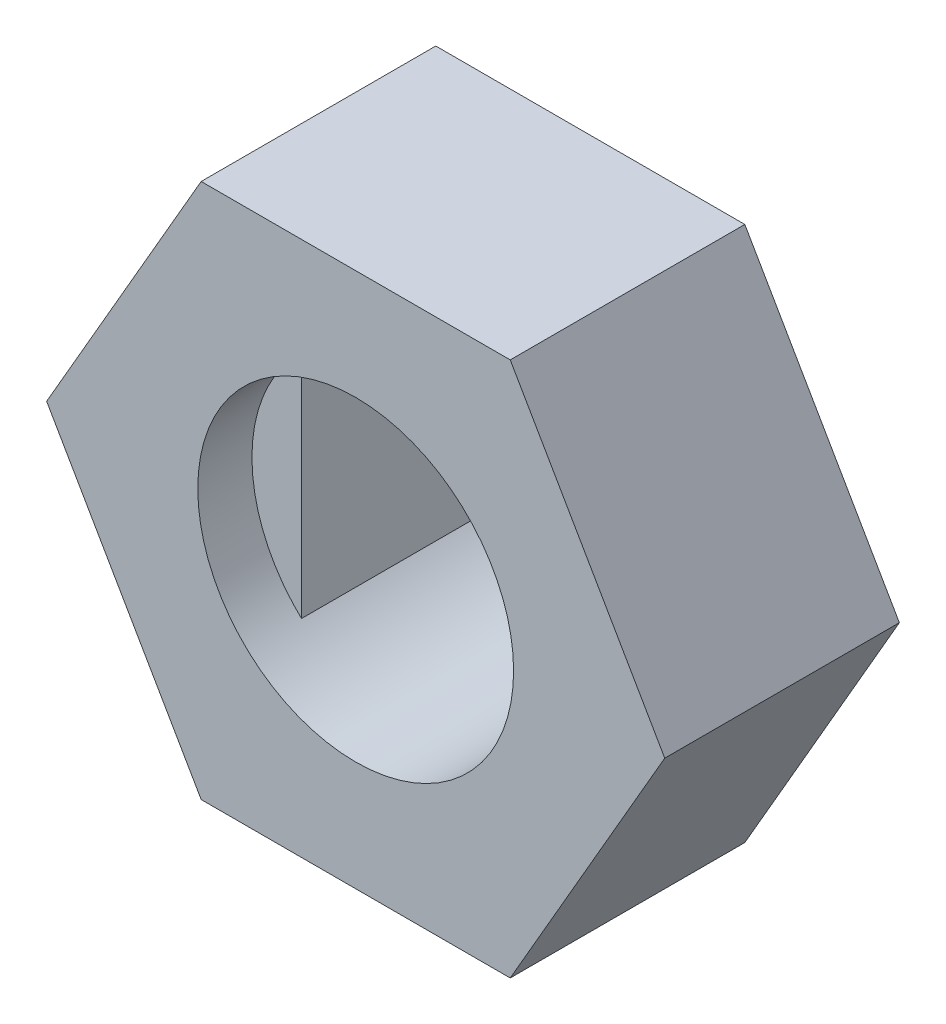
ISO-10303-21;
HEADER;
FILE_DESCRIPTION(('STEP AP214'),'2;1');
FILE_NAME('part.step','',(''),(''),'','','');
FILE_SCHEMA(('AUTOMOTIVE_DESIGN { 1 0 10303 214 1 1 1 1 }'));
ENDSEC;
DATA;
#1=APPLICATION_CONTEXT('core data for automotive mechanical design processes');
#2=APPLICATION_PROTOCOL_DEFINITION('international standard','automotive_design',2000,#1);
#3=PRODUCT_CONTEXT('',#1,'mechanical');
#4=PRODUCT('Part','Part','',(#3));
#5=PRODUCT_RELATED_PRODUCT_CATEGORY('part','',(#4));
#6=PRODUCT_DEFINITION_FORMATION('','',#4);
#7=PRODUCT_DEFINITION_CONTEXT('part definition',#1,'design');
#8=PRODUCT_DEFINITION('design','',#6,#7);
#9=PRODUCT_DEFINITION_SHAPE('','',#8);
#10=(LENGTH_UNIT() NAMED_UNIT(*) SI_UNIT(.MILLI.,.METRE.));
#11=(NAMED_UNIT(*) PLANE_ANGLE_UNIT() SI_UNIT($,.RADIAN.));
#12=(NAMED_UNIT(*) SI_UNIT($,.STERADIAN.) SOLID_ANGLE_UNIT());
#13=UNCERTAINTY_MEASURE_WITH_UNIT(LENGTH_MEASURE(1.E-05),#10,'distance_accuracy_value','');
#14=(GEOMETRIC_REPRESENTATION_CONTEXT(3) GLOBAL_UNCERTAINTY_ASSIGNED_CONTEXT((#13)) GLOBAL_UNIT_ASSIGNED_CONTEXT((#10,
#11,#12)) REPRESENTATION_CONTEXT('',''));
#15=CARTESIAN_POINT('',(0.,0.,0.));
#16=DIRECTION('',(0.,0.,1.));
#17=DIRECTION('',(1.,0.,0.));
#18=AXIS2_PLACEMENT_3D('',#15,#16,#17);
#19=CARTESIAN_POINT('',(0.,0.,4.));
#20=DIRECTION('',(0.,0.,-1.));
#21=DIRECTION('',(-1.,0.,0.));
#22=AXIS2_PLACEMENT_3D('',#19,#20,#21);
#23=CYLINDRICAL_SURFACE('',#22,3.5);
#24=CARTESIAN_POINT('',(0.,0.,0.));
#25=DIRECTION('',(0.,0.,-1.));
#26=DIRECTION('',(-1.,0.,0.));
#27=AXIS2_PLACEMENT_3D('',#24,#25,#26);
#28=CIRCLE('',#27,3.5);
#29=CARTESIAN_POINT('',(2.4,2.5475478405714,0.));
#30=VERTEX_POINT('',#29);
#31=CARTESIAN_POINT('',(2.4,-2.5475478405714,0.));
#32=VERTEX_POINT('',#31);
#33=EDGE_CURVE('E73',#30,#32,#28,.T.);
#34=ORIENTED_EDGE('',*,*,#33,.F.);
#35=DIRECTION('',(0.,0.,-1.));
#36=VECTOR('',#35,1.);
#37=CARTESIAN_POINT('',(2.4,2.5475478405714,4.));
#38=LINE('',#37,#36);
#39=CARTESIAN_POINT('',(2.4,2.5475478405714,4.));
#40=VERTEX_POINT('',#39);
#41=EDGE_CURVE('E12',#40,#30,#38,.T.);
#42=ORIENTED_EDGE('',*,*,#41,.F.);
#43=CARTESIAN_POINT('',(0.,0.,4.));
#44=DIRECTION('',(0.,0.,-1.));
#45=DIRECTION('',(-1.,0.,0.));
#46=AXIS2_PLACEMENT_3D('',#43,#44,#45);
#47=CIRCLE('',#46,3.5);
#48=CARTESIAN_POINT('',(2.4,-2.5475478405714,4.));
#49=VERTEX_POINT('',#48);
#50=EDGE_CURVE('E77',#40,#49,#47,.T.);
#51=ORIENTED_EDGE('',*,*,#50,.T.);
#52=DIRECTION('',(0.,0.,-1.));
#53=VECTOR('',#52,1.);
#54=CARTESIAN_POINT('',(2.4,-2.5475478405714,4.));
#55=LINE('',#54,#53);
#56=EDGE_CURVE('E47',#49,#32,#55,.T.);
#57=ORIENTED_EDGE('',*,*,#56,.T.);
#58=EDGE_LOOP('',(#34,#42,#51,#57));
#59=FACE_BOUND('',#58,.T.);
#60=ADVANCED_FACE('F44',(#59),#23,.T.);
#61=CARTESIAN_POINT('',(2.4,2.5475478405714,4.));
#62=DIRECTION('',(-1.,0.,0.));
#63=DIRECTION('',(0.,0.,1.));
#64=AXIS2_PLACEMENT_3D('',#61,#62,#63);
#65=PLANE('',#64);
#66=DIRECTION('',(0.,1.,0.));
#67=VECTOR('',#66,1.);
#68=CARTESIAN_POINT('',(2.4,2.5475478405714,0.));
#69=LINE('',#68,#67);
#70=EDGE_CURVE('E70',#32,#30,#69,.T.);
#71=ORIENTED_EDGE('',*,*,#70,.F.);
#72=ORIENTED_EDGE('',*,*,#56,.F.);
#73=DIRECTION('',(0.,1.,0.));
#74=VECTOR('',#73,1.);
#75=CARTESIAN_POINT('',(2.4,2.5475478405714,4.));
#76=LINE('',#75,#74);
#77=EDGE_CURVE('E72',#49,#40,#76,.T.);
#78=ORIENTED_EDGE('',*,*,#77,.T.);
#79=ORIENTED_EDGE('',*,*,#41,.T.);
#80=EDGE_LOOP('',(#71,#72,#78,#79));
#81=FACE_BOUND('',#80,.T.);
#82=ADVANCED_FACE('F68',(#81),#65,.T.);
#83=CARTESIAN_POINT('',(0.,0.,4.));
#84=DIRECTION('',(0.,0.,-1.));
#85=DIRECTION('',(-1.,0.,0.));
#86=AXIS2_PLACEMENT_3D('',#83,#84,#85);
#87=PLANE('',#86);
#88=ORIENTED_EDGE('',*,*,#50,.F.);
#89=ORIENTED_EDGE('',*,*,#77,.F.);
#90=EDGE_LOOP('',(#88,#89));
#91=FACE_BOUND('',#90,.T.);
#92=ADVANCED_FACE('F82',(#91),#87,.F.);
#93=CARTESIAN_POINT('',(0.,0.,0.));
#94=DIRECTION('',(0.,0.,-1.));
#95=DIRECTION('',(-1.,0.,0.));
#96=AXIS2_PLACEMENT_3D('',#93,#94,#95);
#97=PLANE('',#96);
#98=ORIENTED_EDGE('',*,*,#33,.T.);
#99=ORIENTED_EDGE('',*,*,#70,.T.);
#100=EDGE_LOOP('',(#98,#99));
#101=FACE_BOUND('',#100,.T.);
#102=ADVANCED_FACE('F76',(#101),#97,.T.);
#103=CLOSED_SHELL('',(#60,#82,#92,#102));
#104=MANIFOLD_SOLID_BREP('B2',#103);
#105=CARTESIAN_POINT('',(0.,0.,4.));
#106=DIRECTION('',(0.,0.,-1.));
#107=DIRECTION('',(-1.,0.,0.));
#108=AXIS2_PLACEMENT_3D('',#105,#106,#107);
#109=CYLINDRICAL_SURFACE('',#108,3.5);
#110=CARTESIAN_POINT('',(0.,0.,0.));
#111=DIRECTION('',(0.,0.,-1.));
#112=DIRECTION('',(-1.,0.,0.));
#113=AXIS2_PLACEMENT_3D('',#110,#111,#112);
#114=CIRCLE('',#113,3.5);
#115=CARTESIAN_POINT('',(-2.4,-2.5475478405714,0.));
#116=VERTEX_POINT('',#115);
#117=CARTESIAN_POINT('',(-2.4,2.5475478405714,0.));
#118=VERTEX_POINT('',#117);
#119=EDGE_CURVE('E154',#116,#118,#114,.T.);
#120=ORIENTED_EDGE('',*,*,#119,.F.);
#121=DIRECTION('',(0.,0.,-1.));
#122=VECTOR('',#121,1.);
#123=CARTESIAN_POINT('',(-2.4,-2.5475478405714,4.));
#124=LINE('',#123,#122);
#125=CARTESIAN_POINT('',(-2.4,-2.5475478405714,4.));
#126=VERTEX_POINT('',#125);
#127=EDGE_CURVE('E42',#126,#116,#124,.T.);
#128=ORIENTED_EDGE('',*,*,#127,.F.);
#129=CARTESIAN_POINT('',(0.,0.,4.));
#130=DIRECTION('',(0.,0.,-1.));
#131=DIRECTION('',(-1.,0.,0.));
#132=AXIS2_PLACEMENT_3D('',#129,#130,#131);
#133=CIRCLE('',#132,3.5);
#134=CARTESIAN_POINT('',(-2.4,2.5475478405714,4.));
#135=VERTEX_POINT('',#134);
#136=EDGE_CURVE('E158',#126,#135,#133,.T.);
#137=ORIENTED_EDGE('',*,*,#136,.T.);
#138=DIRECTION('',(0.,0.,-1.));
#139=VECTOR('',#138,1.);
#140=CARTESIAN_POINT('',(-2.4,2.5475478405714,4.));
#141=LINE('',#140,#139);
#142=EDGE_CURVE('E128',#135,#118,#141,.T.);
#143=ORIENTED_EDGE('',*,*,#142,.T.);
#144=EDGE_LOOP('',(#120,#128,#137,#143));
#145=FACE_BOUND('',#144,.T.);
#146=ADVANCED_FACE('F125',(#145),#109,.T.);
#147=CARTESIAN_POINT('',(-2.4,2.5475478405714,4.));
#148=DIRECTION('',(1.,0.,0.));
#149=DIRECTION('',(0.,0.,-1.));
#150=AXIS2_PLACEMENT_3D('',#147,#148,#149);
#151=PLANE('',#150);
#152=DIRECTION('',(0.,-1.,0.));
#153=VECTOR('',#152,1.);
#154=CARTESIAN_POINT('',(-2.4,2.5475478405714,0.));
#155=LINE('',#154,#153);
#156=EDGE_CURVE('E151',#118,#116,#155,.T.);
#157=ORIENTED_EDGE('',*,*,#156,.F.);
#158=ORIENTED_EDGE('',*,*,#142,.F.);
#159=DIRECTION('',(0.,-1.,0.));
#160=VECTOR('',#159,1.);
#161=CARTESIAN_POINT('',(-2.4,2.5475478405714,4.));
#162=LINE('',#161,#160);
#163=EDGE_CURVE('E153',#135,#126,#162,.T.);
#164=ORIENTED_EDGE('',*,*,#163,.T.);
#165=ORIENTED_EDGE('',*,*,#127,.T.);
#166=EDGE_LOOP('',(#157,#158,#164,#165));
#167=FACE_BOUND('',#166,.T.);
#168=ADVANCED_FACE('F149',(#167),#151,.T.);
#169=CARTESIAN_POINT('',(0.,0.,4.));
#170=DIRECTION('',(0.,0.,-1.));
#171=DIRECTION('',(-1.,0.,0.));
#172=AXIS2_PLACEMENT_3D('',#169,#170,#171);
#173=PLANE('',#172);
#174=ORIENTED_EDGE('',*,*,#136,.F.);
#175=ORIENTED_EDGE('',*,*,#163,.F.);
#176=EDGE_LOOP('',(#174,#175));
#177=FACE_BOUND('',#176,.T.);
#178=ADVANCED_FACE('F163',(#177),#173,.F.);
#179=CARTESIAN_POINT('',(0.,0.,0.));
#180=DIRECTION('',(0.,0.,-1.));
#181=DIRECTION('',(-1.,0.,0.));
#182=AXIS2_PLACEMENT_3D('',#179,#180,#181);
#183=PLANE('',#182);
#184=ORIENTED_EDGE('',*,*,#119,.T.);
#185=ORIENTED_EDGE('',*,*,#156,.T.);
#186=EDGE_LOOP('',(#184,#185));
#187=FACE_BOUND('',#186,.T.);
#188=ADVANCED_FACE('F157',(#187),#183,.T.);
#189=CLOSED_SHELL('',(#146,#168,#178,#188));
#190=MANIFOLD_SOLID_BREP('B6',#189);
#191=CARTESIAN_POINT('',(0.,0.,5.2));
#192=DIRECTION('',(0.,0.,1.));
#193=DIRECTION('',(1.,0.,0.));
#194=AXIS2_PLACEMENT_3D('',#191,#192,#193);
#195=PLANE('',#194);
#196=DIRECTION('',(0.499999999999995,0.866025403784441,0.));
#197=VECTOR('',#196,1.);
#198=CARTESIAN_POINT('',(3.42500000000007,-5.93227401592336,5.2));
#199=LINE('',#198,#197);
#200=CARTESIAN_POINT('',(3.42500000000007,-5.93227401592336,5.2));
#201=VERTEX_POINT('',#200);
#202=CARTESIAN_POINT('',(6.85,0.,5.2));
#203=VERTEX_POINT('',#202);
#204=EDGE_CURVE('E293',#201,#203,#199,.T.);
#205=ORIENTED_EDGE('',*,*,#204,.T.);
#206=DIRECTION('',(-0.500000000000001,0.866025403784438,0.));
#207=VECTOR('',#206,1.);
#208=CARTESIAN_POINT('',(6.85,0.,5.2));
#209=LINE('',#208,#207);
#210=CARTESIAN_POINT('',(3.42499999999999,5.93227401592341,5.2));
#211=VERTEX_POINT('',#210);
#212=EDGE_CURVE('E251',#203,#211,#209,.T.);
#213=ORIENTED_EDGE('',*,*,#212,.T.);
#214=DIRECTION('',(-1.,0.,0.));
#215=VECTOR('',#214,1.);
#216=CARTESIAN_POINT('',(3.42499999999999,5.93227401592341,5.2));
#217=LINE('',#216,#215);
#218=CARTESIAN_POINT('',(-3.42500000000003,5.93227401592339,5.2));
#219=VERTEX_POINT('',#218);
#220=EDGE_CURVE('E264',#211,#219,#217,.T.);
#221=ORIENTED_EDGE('',*,*,#220,.T.);
#222=DIRECTION('',(-0.499999999999995,-0.866025403784442,0.));
#223=VECTOR('',#222,1.);
#224=CARTESIAN_POINT('',(-3.42500000000003,5.93227401592339,5.2));
#225=LINE('',#224,#223);
#226=CARTESIAN_POINT('',(-6.85,0.,5.2));
#227=VERTEX_POINT('',#226);
#228=EDGE_CURVE('E258',#219,#227,#225,.T.);
#229=ORIENTED_EDGE('',*,*,#228,.T.);
#230=DIRECTION('',(0.500000000000007,-0.866025403784435,0.));
#231=VECTOR('',#230,1.);
#232=CARTESIAN_POINT('',(-6.85,0.,5.2));
#233=LINE('',#232,#231);
#234=CARTESIAN_POINT('',(-3.42499999999994,-5.93227401592343,5.2));
#235=VERTEX_POINT('',#234);
#236=EDGE_CURVE('E262',#227,#235,#233,.T.);
#237=ORIENTED_EDGE('',*,*,#236,.T.);
#238=DIRECTION('',(1.,0.,0.));
#239=VECTOR('',#238,1.);
#240=CARTESIAN_POINT('',(-3.42499999999994,-5.93227401592343,5.2));
#241=LINE('',#240,#239);
#242=EDGE_CURVE('E214',#235,#201,#241,.T.);
#243=ORIENTED_EDGE('',*,*,#242,.T.);
#244=EDGE_LOOP('',(#205,#213,#221,#229,#237,#243));
#245=FACE_BOUND('',#244,.T.);
#246=CARTESIAN_POINT('',(0.,0.,5.2));
#247=DIRECTION('',(0.,0.,1.));
#248=DIRECTION('',(1.,0.,0.));
#249=AXIS2_PLACEMENT_3D('',#246,#247,#248);
#250=CIRCLE('',#249,3.5);
#251=CARTESIAN_POINT('',(3.5,0.,5.2));
#252=VERTEX_POINT('',#251);
#253=EDGE_CURVE('E286',#252,#252,#250,.T.);
#254=ORIENTED_EDGE('',*,*,#253,.F.);
#255=EDGE_LOOP('',(#254));
#256=FACE_BOUND('',#255,.T.);
#257=ADVANCED_FACE('F197',(#245,#256),#195,.T.);
#258=CARTESIAN_POINT('',(0.,0.,0.));
#259=DIRECTION('',(0.,0.,1.));
#260=DIRECTION('',(1.,0.,0.));
#261=AXIS2_PLACEMENT_3D('',#258,#259,#260);
#262=PLANE('',#261);
#263=DIRECTION('',(0.499999999999995,0.866025403784441,0.));
#264=VECTOR('',#263,1.);
#265=CARTESIAN_POINT('',(3.42500000000007,-5.93227401592336,0.));
#266=LINE('',#265,#264);
#267=CARTESIAN_POINT('',(3.42500000000007,-5.93227401592336,0.));
#268=VERTEX_POINT('',#267);
#269=CARTESIAN_POINT('',(6.85,0.,0.));
#270=VERTEX_POINT('',#269);
#271=EDGE_CURVE('E282',#268,#270,#266,.T.);
#272=ORIENTED_EDGE('',*,*,#271,.F.);
#273=DIRECTION('',(1.,0.,0.));
#274=VECTOR('',#273,1.);
#275=CARTESIAN_POINT('',(-3.42499999999994,-5.93227401592343,0.));
#276=LINE('',#275,#274);
#277=CARTESIAN_POINT('',(-3.42499999999994,-5.93227401592343,0.));
#278=VERTEX_POINT('',#277);
#279=EDGE_CURVE('E243',#278,#268,#276,.T.);
#280=ORIENTED_EDGE('',*,*,#279,.F.);
#281=DIRECTION('',(0.500000000000007,-0.866025403784435,0.));
#282=VECTOR('',#281,1.);
#283=CARTESIAN_POINT('',(-6.85,0.,0.));
#284=LINE('',#283,#282);
#285=CARTESIAN_POINT('',(-6.85,0.,0.));
#286=VERTEX_POINT('',#285);
#287=EDGE_CURVE('E237',#286,#278,#284,.T.);
#288=ORIENTED_EDGE('',*,*,#287,.F.);
#289=DIRECTION('',(-0.499999999999995,-0.866025403784442,0.));
#290=VECTOR('',#289,1.);
#291=CARTESIAN_POINT('',(-3.42500000000003,5.93227401592339,0.));
#292=LINE('',#291,#290);
#293=CARTESIAN_POINT('',(-3.42500000000003,5.93227401592339,0.));
#294=VERTEX_POINT('',#293);
#295=EDGE_CURVE('E272',#294,#286,#292,.T.);
#296=ORIENTED_EDGE('',*,*,#295,.F.);
#297=DIRECTION('',(-1.,0.,0.));
#298=VECTOR('',#297,1.);
#299=CARTESIAN_POINT('',(3.42499999999999,5.93227401592341,0.));
#300=LINE('',#299,#298);
#301=CARTESIAN_POINT('',(3.42499999999999,5.93227401592341,0.));
#302=VERTEX_POINT('',#301);
#303=EDGE_CURVE('E288',#302,#294,#300,.T.);
#304=ORIENTED_EDGE('',*,*,#303,.F.);
#305=DIRECTION('',(-0.500000000000001,0.866025403784438,0.));
#306=VECTOR('',#305,1.);
#307=CARTESIAN_POINT('',(6.85,0.,0.));
#308=LINE('',#307,#306);
#309=EDGE_CURVE('E285',#270,#302,#308,.T.);
#310=ORIENTED_EDGE('',*,*,#309,.F.);
#311=EDGE_LOOP('',(#272,#280,#288,#296,#304,#310));
#312=FACE_BOUND('',#311,.T.);
#313=CARTESIAN_POINT('',(0.,0.,0.));
#314=DIRECTION('',(0.,0.,1.));
#315=DIRECTION('',(1.,0.,0.));
#316=AXIS2_PLACEMENT_3D('',#313,#314,#315);
#317=CIRCLE('',#316,3.5);
#318=CARTESIAN_POINT('',(3.5,0.,0.));
#319=VERTEX_POINT('',#318);
#320=EDGE_CURVE('E386',#319,#319,#317,.T.);
#321=ORIENTED_EDGE('',*,*,#320,.T.);
#322=EDGE_LOOP('',(#321));
#323=FACE_BOUND('',#322,.T.);
#324=ADVANCED_FACE('F302',(#312,#323),#262,.F.);
#325=CARTESIAN_POINT('',(3.42500000000007,-5.93227401592336,5.2));
#326=DIRECTION('',(-0.866025403784442,0.499999999999995,0.));
#327=DIRECTION('',(-0.499999999999995,-0.866025403784442,0.));
#328=AXIS2_PLACEMENT_3D('',#325,#326,#327);
#329=PLANE('',#328);
#330=ORIENTED_EDGE('',*,*,#271,.T.);
#331=DIRECTION('',(0.,0.,-1.));
#332=VECTOR('',#331,1.);
#333=CARTESIAN_POINT('',(6.85,0.,5.2));
#334=LINE('',#333,#332);
#335=EDGE_CURVE('E123',#203,#270,#334,.T.);
#336=ORIENTED_EDGE('',*,*,#335,.F.);
#337=ORIENTED_EDGE('',*,*,#204,.F.);
#338=DIRECTION('',(0.,0.,-1.));
#339=VECTOR('',#338,1.);
#340=CARTESIAN_POINT('',(3.42500000000007,-5.93227401592336,5.2));
#341=LINE('',#340,#339);
#342=EDGE_CURVE('E278',#201,#268,#341,.T.);
#343=ORIENTED_EDGE('',*,*,#342,.T.);
#344=EDGE_LOOP('',(#330,#336,#337,#343));
#345=FACE_BOUND('',#344,.T.);
#346=ADVANCED_FACE('F199',(#345),#329,.F.);
#347=CARTESIAN_POINT('',(6.85,0.,5.2));
#348=DIRECTION('',(-0.866025403784438,-0.500000000000001,0.));
#349=DIRECTION('',(0.500000000000001,-0.866025403784438,0.));
#350=AXIS2_PLACEMENT_3D('',#347,#348,#349);
#351=PLANE('',#350);
#352=ORIENTED_EDGE('',*,*,#309,.T.);
#353=DIRECTION('',(0.,0.,-1.));
#354=VECTOR('',#353,1.);
#355=CARTESIAN_POINT('',(3.42499999999999,5.93227401592341,5.2));
#356=LINE('',#355,#354);
#357=EDGE_CURVE('E206',#211,#302,#356,.T.);
#358=ORIENTED_EDGE('',*,*,#357,.F.);
#359=ORIENTED_EDGE('',*,*,#212,.F.);
#360=ORIENTED_EDGE('',*,*,#335,.T.);
#361=EDGE_LOOP('',(#352,#358,#359,#360));
#362=FACE_BOUND('',#361,.T.);
#363=ADVANCED_FACE('F327',(#362),#351,.F.);
#364=CARTESIAN_POINT('',(3.42499999999999,5.93227401592341,5.2));
#365=DIRECTION('',(0.,-1.,0.));
#366=DIRECTION('',(1.,0.,0.));
#367=AXIS2_PLACEMENT_3D('',#364,#365,#366);
#368=PLANE('',#367);
#369=ORIENTED_EDGE('',*,*,#303,.T.);
#370=DIRECTION('',(0.,0.,-1.));
#371=VECTOR('',#370,1.);
#372=CARTESIAN_POINT('',(-3.42500000000003,5.93227401592339,5.2));
#373=LINE('',#372,#371);
#374=EDGE_CURVE('E273',#219,#294,#373,.T.);
#375=ORIENTED_EDGE('',*,*,#374,.F.);
#376=ORIENTED_EDGE('',*,*,#220,.F.);
#377=ORIENTED_EDGE('',*,*,#357,.T.);
#378=EDGE_LOOP('',(#369,#375,#376,#377));
#379=FACE_BOUND('',#378,.T.);
#380=ADVANCED_FACE('F299',(#379),#368,.F.);
#381=CARTESIAN_POINT('',(-3.42500000000003,5.93227401592339,5.2));
#382=DIRECTION('',(0.866025403784441,-0.499999999999995,0.));
#383=DIRECTION('',(0.499999999999995,0.866025403784442,0.));
#384=AXIS2_PLACEMENT_3D('',#381,#382,#383);
#385=PLANE('',#384);
#386=ORIENTED_EDGE('',*,*,#295,.T.);
#387=DIRECTION('',(0.,0.,-1.));
#388=VECTOR('',#387,1.);
#389=CARTESIAN_POINT('',(-6.85,0.,5.2));
#390=LINE('',#389,#388);
#391=EDGE_CURVE('E269',#227,#286,#390,.T.);
#392=ORIENTED_EDGE('',*,*,#391,.F.);
#393=ORIENTED_EDGE('',*,*,#228,.F.);
#394=ORIENTED_EDGE('',*,*,#374,.T.);
#395=EDGE_LOOP('',(#386,#392,#393,#394));
#396=FACE_BOUND('',#395,.T.);
#397=ADVANCED_FACE('F270',(#396),#385,.F.);
#398=CARTESIAN_POINT('',(-6.85,0.,5.2));
#399=DIRECTION('',(0.866025403784435,0.500000000000007,0.));
#400=DIRECTION('',(-0.500000000000007,0.866025403784435,0.));
#401=AXIS2_PLACEMENT_3D('',#398,#399,#400);
#402=PLANE('',#401);
#403=ORIENTED_EDGE('',*,*,#287,.T.);
#404=DIRECTION('',(0.,0.,-1.));
#405=VECTOR('',#404,1.);
#406=CARTESIAN_POINT('',(-3.42499999999994,-5.93227401592343,5.2));
#407=LINE('',#406,#405);
#408=EDGE_CURVE('E274',#235,#278,#407,.T.);
#409=ORIENTED_EDGE('',*,*,#408,.F.);
#410=ORIENTED_EDGE('',*,*,#236,.F.);
#411=ORIENTED_EDGE('',*,*,#391,.T.);
#412=EDGE_LOOP('',(#403,#409,#410,#411));
#413=FACE_BOUND('',#412,.T.);
#414=ADVANCED_FACE('F276',(#413),#402,.F.);
#415=CARTESIAN_POINT('',(-3.42499999999994,-5.93227401592343,5.2));
#416=DIRECTION('',(0.,1.,0.));
#417=DIRECTION('',(-1.,0.,0.));
#418=AXIS2_PLACEMENT_3D('',#415,#416,#417);
#419=PLANE('',#418);
#420=ORIENTED_EDGE('',*,*,#279,.T.);
#421=ORIENTED_EDGE('',*,*,#342,.F.);
#422=ORIENTED_EDGE('',*,*,#242,.F.);
#423=ORIENTED_EDGE('',*,*,#408,.T.);
#424=EDGE_LOOP('',(#420,#421,#422,#423));
#425=FACE_BOUND('',#424,.T.);
#426=ADVANCED_FACE('F307',(#425),#419,.F.);
#427=CARTESIAN_POINT('',(0.,0.,5.2));
#428=DIRECTION('',(0.,0.,-1.));
#429=DIRECTION('',(-1.,0.,0.));
#430=AXIS2_PLACEMENT_3D('',#427,#428,#429);
#431=CYLINDRICAL_SURFACE('',#430,3.5);
#432=ORIENTED_EDGE('',*,*,#253,.T.);
#433=EDGE_LOOP('',(#432));
#434=FACE_BOUND('',#433,.T.);
#435=ORIENTED_EDGE('',*,*,#320,.F.);
#436=EDGE_LOOP('',(#435));
#437=FACE_BOUND('',#436,.T.);
#438=ADVANCED_FACE('F309',(#434,#437),#431,.F.);
#439=CLOSED_SHELL('',(#257,#324,#346,#363,#380,#397,#414,#426,#438));
#440=MANIFOLD_SOLID_BREP('B36',#439);
#441=ADVANCED_BREP_SHAPE_REPRESENTATION('',(#18,#104,#190,#440),#14);
#442=SHAPE_DEFINITION_REPRESENTATION(#9,#441);
ENDSEC;
END-ISO-10303-21;
